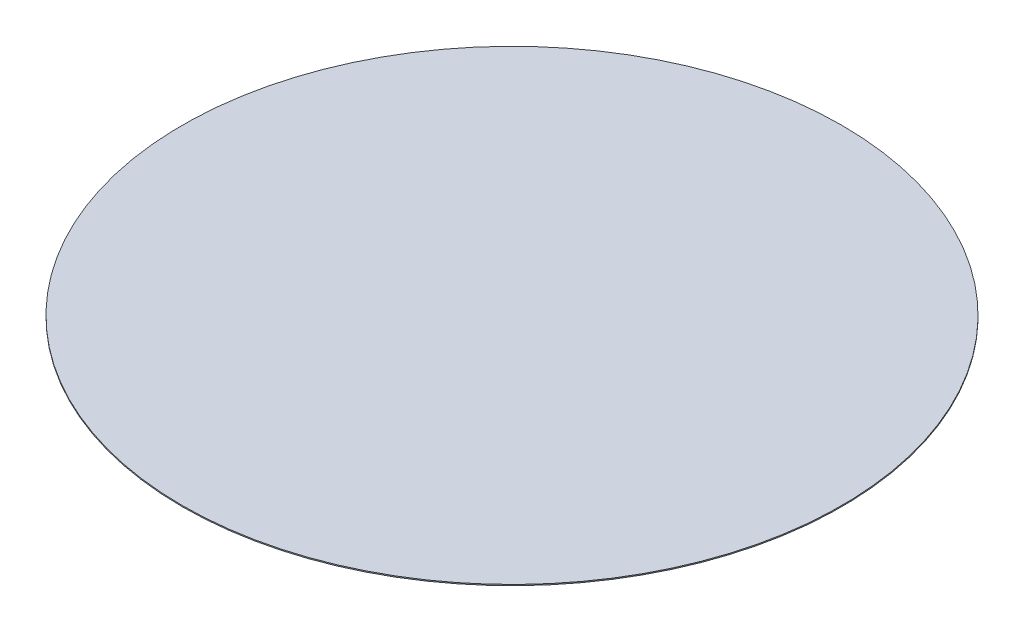
ISO-10303-21;
HEADER;
FILE_DESCRIPTION(('STEP AP214'),'2;1');
FILE_NAME('part.step','',(''),(''),'','','');
FILE_SCHEMA(('AUTOMOTIVE_DESIGN { 1 0 10303 214 1 1 1 1 }'));
ENDSEC;
DATA;
#1=APPLICATION_CONTEXT('core data for automotive mechanical design processes');
#2=APPLICATION_PROTOCOL_DEFINITION('international standard','automotive_design',2000,#1);
#3=PRODUCT_CONTEXT('',#1,'mechanical');
#4=PRODUCT('Part','Part','',(#3));
#5=PRODUCT_RELATED_PRODUCT_CATEGORY('part','',(#4));
#6=PRODUCT_DEFINITION_FORMATION('','',#4);
#7=PRODUCT_DEFINITION_CONTEXT('part definition',#1,'design');
#8=PRODUCT_DEFINITION('design','',#6,#7);
#9=PRODUCT_DEFINITION_SHAPE('','',#8);
#10=(LENGTH_UNIT() NAMED_UNIT(*) SI_UNIT(.MILLI.,.METRE.));
#11=(NAMED_UNIT(*) PLANE_ANGLE_UNIT() SI_UNIT($,.RADIAN.));
#12=(NAMED_UNIT(*) SI_UNIT($,.STERADIAN.) SOLID_ANGLE_UNIT());
#13=UNCERTAINTY_MEASURE_WITH_UNIT(LENGTH_MEASURE(1.E-05),#10,'distance_accuracy_value','');
#14=(GEOMETRIC_REPRESENTATION_CONTEXT(3) GLOBAL_UNCERTAINTY_ASSIGNED_CONTEXT((#13)) GLOBAL_UNIT_ASSIGNED_CONTEXT((#10,
#11,#12)) REPRESENTATION_CONTEXT('',''));
#15=CARTESIAN_POINT('',(0.,0.,0.));
#16=DIRECTION('',(0.,0.,1.));
#17=DIRECTION('',(1.,0.,0.));
#18=AXIS2_PLACEMENT_3D('',#15,#16,#17);
#19=CARTESIAN_POINT('',(0.,6.,0.));
#20=DIRECTION('',(0.,1.,0.));
#21=DIRECTION('',(0.,0.,1.));
#22=AXIS2_PLACEMENT_3D('',#19,#20,#21);
#23=CYLINDRICAL_SURFACE('',#22,609.6);
#24=CARTESIAN_POINT('',(0.,6.,0.));
#25=DIRECTION('',(0.,1.,0.));
#26=DIRECTION('',(0.,0.,1.));
#27=AXIS2_PLACEMENT_3D('',#24,#25,#26);
#28=CIRCLE('',#27,609.6);
#29=CARTESIAN_POINT('',(0.,6.,609.6));
#30=VERTEX_POINT('',#29);
#31=EDGE_CURVE('E10',#30,#30,#28,.T.);
#32=ORIENTED_EDGE('',*,*,#31,.F.);
#33=EDGE_LOOP('',(#32));
#34=FACE_BOUND('',#33,.T.);
#35=CARTESIAN_POINT('',(0.,4.,0.));
#36=DIRECTION('',(0.,1.,0.));
#37=DIRECTION('',(0.,0.,1.));
#38=AXIS2_PLACEMENT_3D('',#35,#36,#37);
#39=CIRCLE('',#38,609.6);
#40=CARTESIAN_POINT('',(0.,4.,609.6));
#41=VERTEX_POINT('',#40);
#42=EDGE_CURVE('E48',#41,#41,#39,.T.);
#43=ORIENTED_EDGE('',*,*,#42,.T.);
#44=EDGE_LOOP('',(#43));
#45=FACE_BOUND('',#44,.T.);
#46=ADVANCED_FACE('F45',(#34,#45),#23,.T.);
#47=CARTESIAN_POINT('',(0.,6.,0.));
#48=DIRECTION('',(0.,1.,0.));
#49=DIRECTION('',(0.,0.,1.));
#50=AXIS2_PLACEMENT_3D('',#47,#48,#49);
#51=PLANE('',#50);
#52=ORIENTED_EDGE('',*,*,#31,.T.);
#53=EDGE_LOOP('',(#52));
#54=FACE_BOUND('',#53,.T.);
#55=ADVANCED_FACE('F60',(#54),#51,.T.);
#56=CARTESIAN_POINT('',(0.,4.,0.));
#57=DIRECTION('',(0.,1.,0.));
#58=DIRECTION('',(0.,0.,1.));
#59=AXIS2_PLACEMENT_3D('',#56,#57,#58);
#60=PLANE('',#59);
#61=ORIENTED_EDGE('',*,*,#42,.F.);
#62=EDGE_LOOP('',(#61));
#63=FACE_BOUND('',#62,.T.);
#64=ADVANCED_FACE('F58',(#63),#60,.F.);
#65=CLOSED_SHELL('',(#46,#55,#64));
#66=MANIFOLD_SOLID_BREP('B2',#65);
#67=ADVANCED_BREP_SHAPE_REPRESENTATION('',(#18,#66),#14);
#68=SHAPE_DEFINITION_REPRESENTATION(#9,#67);
ENDSEC;
END-ISO-10303-21;
